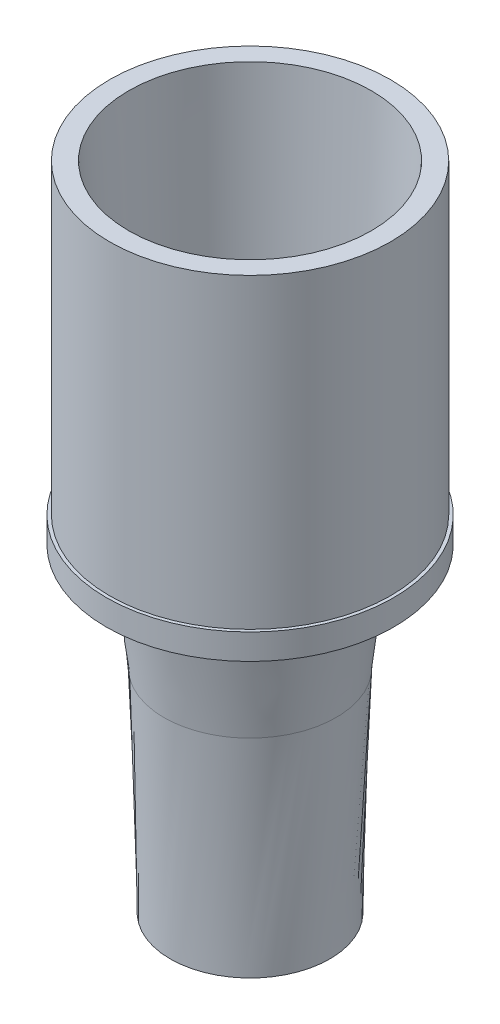
ISO-10303-21;
HEADER;
FILE_DESCRIPTION(('STEP AP214'),'2;1');
FILE_NAME('part.step','',(''),(''),'','','');
FILE_SCHEMA(('AUTOMOTIVE_DESIGN { 1 0 10303 214 1 1 1 1 }'));
ENDSEC;
DATA;
#1=APPLICATION_CONTEXT('core data for automotive mechanical design processes');
#2=APPLICATION_PROTOCOL_DEFINITION('international standard','automotive_design',2000,#1);
#3=PRODUCT_CONTEXT('',#1,'mechanical');
#4=PRODUCT('Part','Part','',(#3));
#5=PRODUCT_RELATED_PRODUCT_CATEGORY('part','',(#4));
#6=PRODUCT_DEFINITION_FORMATION('','',#4);
#7=PRODUCT_DEFINITION_CONTEXT('part definition',#1,'design');
#8=PRODUCT_DEFINITION('design','',#6,#7);
#9=PRODUCT_DEFINITION_SHAPE('','',#8);
#10=(LENGTH_UNIT() NAMED_UNIT(*) SI_UNIT(.MILLI.,.METRE.));
#11=(NAMED_UNIT(*) PLANE_ANGLE_UNIT() SI_UNIT($,.RADIAN.));
#12=(NAMED_UNIT(*) SI_UNIT($,.STERADIAN.) SOLID_ANGLE_UNIT());
#13=UNCERTAINTY_MEASURE_WITH_UNIT(LENGTH_MEASURE(1.E-05),#10,'distance_accuracy_value','');
#14=(GEOMETRIC_REPRESENTATION_CONTEXT(3) GLOBAL_UNCERTAINTY_ASSIGNED_CONTEXT((#13)) GLOBAL_UNIT_ASSIGNED_CONTEXT((#10,
#11,#12)) REPRESENTATION_CONTEXT('',''));
#15=CARTESIAN_POINT('',(0.,0.,0.));
#16=DIRECTION('',(0.,0.,1.));
#17=DIRECTION('',(1.,0.,0.));
#18=AXIS2_PLACEMENT_3D('',#15,#16,#17);
#19=CARTESIAN_POINT('',(0.,27.,0.));
#20=DIRECTION('',(0.,1.,0.));
#21=DIRECTION('',(0.,0.,1.));
#22=AXIS2_PLACEMENT_3D('',#19,#20,#21);
#23=PLANE('',#22);
#24=CARTESIAN_POINT('',(0.,27.,0.));
#25=DIRECTION('',(0.,1.,0.));
#26=DIRECTION('',(0.,0.,1.));
#27=AXIS2_PLACEMENT_3D('',#24,#25,#26);
#28=CIRCLE('',#27,5.75);
#29=CARTESIAN_POINT('',(0.,27.,5.75));
#30=VERTEX_POINT('',#29);
#31=EDGE_CURVE('E162',#30,#30,#28,.T.);
#32=ORIENTED_EDGE('',*,*,#31,.F.);
#33=EDGE_LOOP('',(#32));
#34=FACE_BOUND('',#33,.T.);
#35=CARTESIAN_POINT('',(0.,27.,0.));
#36=DIRECTION('',(0.,-1.,0.));
#37=DIRECTION('',(0.,0.,1.));
#38=AXIS2_PLACEMENT_3D('',#35,#36,#37);
#39=CIRCLE('',#38,8.5);
#40=CARTESIAN_POINT('',(0.,27.,8.5));
#41=VERTEX_POINT('',#40);
#42=EDGE_CURVE('E213',#41,#41,#39,.T.);
#43=ORIENTED_EDGE('',*,*,#42,.F.);
#44=EDGE_LOOP('',(#43));
#45=FACE_BOUND('',#44,.T.);
#46=ADVANCED_FACE('F59',(#34,#45),#23,.T.);
#47=CARTESIAN_POINT('',(-1.11708454091989,0.,-6.14935948928324));
#48=CARTESIAN_POINT('',(-4.48664223025245,25.,-5.69495755012409));
#49=CARTESIAN_POINT('',(-13.4158035194864,0.,-3.91519040744345));
#50=CARTESIAN_POINT('',(-15.8765573305006,25.,3.2783269103808));
#51=CARTESIAN_POINT('',(-11.1816344376466,0.,8.38352857112303));
#52=CARTESIAN_POINT('',(-6.90327286999572,25.,14.668242010629));
#53=CARTESIAN_POINT('',(1.1170845409199,0.,6.14935948928324));
#54=CARTESIAN_POINT('',(4.48664223025244,25.,5.69495755012409));
#55=CARTESIAN_POINT('',(13.4158035194864,0.,3.91519040744344));
#56=CARTESIAN_POINT('',(15.8765573305006,25.,-3.2783269103808));
#57=CARTESIAN_POINT('',(11.1816344376466,0.,-8.38352857112303));
#58=CARTESIAN_POINT('',(6.90327286999574,25.,-14.668242010629));
#59=CARTESIAN_POINT('',(-1.11708454091989,0.,-6.14935948928324));
#60=CARTESIAN_POINT('',(-4.48664223025245,25.,-5.69495755012409));
#61=(BOUNDED_SURFACE() B_SPLINE_SURFACE(3,1,((#47,#48),(#49,#50),(#51,#52),(#53,#54),(#55,#56),
(#57,#58),(#59,#60)),.UNSPECIFIED.,.T.,.F.,.F.) B_SPLINE_SURFACE_WITH_KNOTS((4,3,4),(2,2),(0.,
0.5,1.),(0.,1.),.UNSPECIFIED.) GEOMETRIC_REPRESENTATION_ITEM() RATIONAL_B_SPLINE_SURFACE(((1.,
1.),(0.333333333333333,0.333333333333334),(0.333333333333333,0.333333333333334),(1.,1.),
(0.333333333333333,0.333333333333333),(0.333333333333333,0.333333333333333),(1.,1.))) REPRESENTATION_ITEM('') SURFACE());
#62=CARTESIAN_POINT('',(0.,16.6169318268734,0.));
#63=DIRECTION('',(0.,1.,0.));
#64=DIRECTION('',(0.,0.,1.));
#65=AXIS2_PLACEMENT_3D('',#62,#63,#64);
#66=CIRCLE('',#65,6.74233231657427);
#67=CARTESIAN_POINT('',(-3.35675295733415,16.6169318268734,-5.84732884748297));
#68=VERTEX_POINT('',#67);
#69=EDGE_CURVE('E12',#68,#68,#66,.T.);
#70=CARTESIAN_POINT('',(0.,0.,0.));
#71=DIRECTION('',(0.,1.,0.));
#72=DIRECTION('',(0.,0.,1.));
#73=AXIS2_PLACEMENT_3D('',#70,#71,#72);
#74=CIRCLE('',#73,6.25);
#75=CARTESIAN_POINT('',(-1.11708454091989,0.,-6.14935948928324));
#76=VERTEX_POINT('',#75);
#77=EDGE_CURVE('E67',#76,#76,#74,.T.);
#78=CARTESIAN_POINT('',(-3.35675295733415,16.6169318268734,-5.84732884748297));
#79=CARTESIAN_POINT('',(-3.3334230779965,16.4438387870102,-5.85047500000172));
#80=CARTESIAN_POINT('',(-3.31009319865885,16.2707457471469,-5.85362115252047));
#81=CARTESIAN_POINT('',(-3.26343343998355,15.9245596674204,-5.85991345755798));
#82=CARTESIAN_POINT('',(-3.2401035606459,15.7514666275571,-5.86305961007673));
#83=CARTESIAN_POINT('',(-3.19344380197061,15.4052805478306,-5.86935191511424));
#84=CARTESIAN_POINT('',(-3.17011392263296,15.2321875079673,-5.87249806763299));
#85=CARTESIAN_POINT('',(-3.12345416395766,14.8860014282408,-5.8787903726705));
#86=CARTESIAN_POINT('',(-3.10012428462001,14.7129083883775,-5.88193652518925));
#87=CARTESIAN_POINT('',(-3.05346452594471,14.366722308651,-5.88822883022675));
#88=CARTESIAN_POINT('',(-3.03013464660707,14.1936292687877,-5.89137498274551));
#89=CARTESIAN_POINT('',(-2.98347488793177,13.8474431890612,-5.89766728778301));
#90=CARTESIAN_POINT('',(-2.96014500859412,13.6743501491979,-5.90081344030177));
#91=CARTESIAN_POINT('',(-2.91348524991882,13.3281640694714,-5.90710574533927));
#92=CARTESIAN_POINT('',(-2.89015537058118,13.1550710296081,-5.91025189785802));
#93=CARTESIAN_POINT('',(-2.84349561190588,12.8088849498816,-5.91654420289553));
#94=CARTESIAN_POINT('',(-2.82016573256823,12.6357919100183,-5.91969035541428));
#95=CARTESIAN_POINT('',(-2.77350597389293,12.2896058302918,-5.92598266045179));
#96=CARTESIAN_POINT('',(-2.75017609455529,12.1165127904285,-5.92912881297054));
#97=CARTESIAN_POINT('',(-2.70351633587999,11.770326710702,-5.93542111800805));
#98=CARTESIAN_POINT('',(-2.68018645654234,11.5972336708388,-5.9385672705268));
#99=CARTESIAN_POINT('',(-2.63352669786704,11.2510475911122,-5.94485957556431));
#100=CARTESIAN_POINT('',(-2.61019681852939,11.077954551249,-5.94800572808306));
#101=CARTESIAN_POINT('',(-2.5635370598541,10.7317684715224,-5.95429803312056));
#102=CARTESIAN_POINT('',(-2.54020718051645,10.5586754316592,-5.95744418563932));
#103=CARTESIAN_POINT('',(-2.49354742184115,10.2124893519326,-5.96373649067682));
#104=CARTESIAN_POINT('',(-2.4702175425035,10.0393963120694,-5.96688264319558));
#105=CARTESIAN_POINT('',(-2.42355778382821,9.69321023234284,-5.97317494823308));
#106=CARTESIAN_POINT('',(-2.40022790449056,9.52011719247957,-5.97632110075183));
#107=CARTESIAN_POINT('',(-2.35356814581526,9.17393111275304,-5.98261340578934));
#108=CARTESIAN_POINT('',(-2.33023826647761,9.00083807288978,-5.98575955830809));
#109=CARTESIAN_POINT('',(-2.28357850780232,8.65465199316325,-5.9920518633456));
#110=CARTESIAN_POINT('',(-2.26024862846467,8.48155895329998,-5.99519801586435));
#111=CARTESIAN_POINT('',(-2.21358886978937,8.13537287357346,-6.00149032090186));
#112=CARTESIAN_POINT('',(-2.19025899045172,7.96227983371019,-6.00463647342061));
#113=CARTESIAN_POINT('',(-2.14359923177643,7.61609375398366,-6.01092877845811));
#114=CARTESIAN_POINT('',(-2.12026935243878,7.44300071412039,-6.01407493097687));
#115=CARTESIAN_POINT('',(-2.07360959376348,7.09681463439386,-6.02036723601437));
#116=CARTESIAN_POINT('',(-2.05027971442583,6.9237215945306,-6.02351338853313));
#117=CARTESIAN_POINT('',(-2.00361995575053,6.57753551480407,-6.02980569357063));
#118=CARTESIAN_POINT('',(-1.98029007641289,6.4044424749408,-6.03295184608938));
#119=CARTESIAN_POINT('',(-1.93363031773759,6.05825639521427,-6.03924415112689));
#120=CARTESIAN_POINT('',(-1.91030043839994,5.88516335535101,-6.04239030364564));
#121=CARTESIAN_POINT('',(-1.86364067972464,5.53897727562448,-6.04868260868315));
#122=CARTESIAN_POINT('',(-1.840310800387,5.36588423576121,-6.0518287612019));
#123=CARTESIAN_POINT('',(-1.7936510417117,5.01969815603468,-6.05812106623941));
#124=CARTESIAN_POINT('',(-1.77032116237405,4.84660511617142,-6.06126721875816));
#125=CARTESIAN_POINT('',(-1.72366140369875,4.50041903644489,-6.06755952379566));
#126=CARTESIAN_POINT('',(-1.7003315243611,4.32732599658162,-6.07070567631442));
#127=CARTESIAN_POINT('',(-1.65367176568581,3.9811399168551,-6.07699798135192));
#128=CARTESIAN_POINT('',(-1.63034188634816,3.80804687699183,-6.08014413387068));
#129=CARTESIAN_POINT('',(-1.58368212767286,3.4618607972653,-6.08643643890818));
#130=CARTESIAN_POINT('',(-1.56035224833521,3.28876775740203,-6.08958259142693));
#131=CARTESIAN_POINT('',(-1.51369248965992,2.9425816776755,-6.09587489646444));
#132=CARTESIAN_POINT('',(-1.49036261032227,2.76948863781224,-6.09902104898319));
#133=CARTESIAN_POINT('',(-1.44370285164697,2.42330255808571,-6.1053133540207));
#134=CARTESIAN_POINT('',(-1.42037297230932,2.25020951822245,-6.10845950653945));
#135=CARTESIAN_POINT('',(-1.37371321363403,1.90402343849592,-6.11475181157696));
#136=CARTESIAN_POINT('',(-1.35038333429638,1.73093039863265,-6.11789796409571));
#137=CARTESIAN_POINT('',(-1.30372357562108,1.38474431890612,-6.12419026913321));
#138=CARTESIAN_POINT('',(-1.28039369628343,1.21165127904286,-6.12733642165197));
#139=CARTESIAN_POINT('',(-1.23373393760814,0.865465199316325,-6.13362872668947));
#140=CARTESIAN_POINT('',(-1.21040405827049,0.692372159453059,-6.13677487920823));
#141=CARTESIAN_POINT('',(-1.16374429959519,0.346186079726529,-6.14306718424573));
#142=CARTESIAN_POINT('',(-1.14041442025754,0.173093039863265,-6.14621333676448));
#143=CARTESIAN_POINT('',(-1.11708454091989,0.,-6.14935948928324));
#144=B_SPLINE_CURVE_WITH_KNOTS('',3,(#78,#79,#80,#81,#82,#83,#84,#85,#86,#87,#88,#89,#90,#91,
#92,#93,#94,#95,#96,#97,#98,#99,#100,#101,#102,#103,#104,#105,#106,#107,#108,#109,#110,#111,
#112,#113,#114,#115,#116,#117,#118,#119,#120,#121,#122,#123,#124,#125,#126,#127,#128,#129,#130,
#131,#132,#133,#134,#135,#136,#137,#138,#139,#140,#141,#142,#143),.UNSPECIFIED.,.F.,.F.,(4,2,2,
2,2,2,2,2,2,2,2,2,2,2,2,2,2,2,2,2,2,2,2,2,2,2,2,2,2,2,2,2,4),(0.,0.52405957481204,
1.04811914962408,1.57217872443612,2.09623829924817,2.62029787406021,3.14435744887225,
3.66841702368429,4.19247659849633,4.71653617330837,5.24059574812041,5.76465532293245,
6.28871489774449,6.81277447255653,7.33683404736857,7.86089362218061,8.38495319699265,
8.90901277180469,9.43307234661674,9.95713192142878,10.4811914962408,11.0052510710529,
11.5293106458649,12.0533702206769,12.577429795489,13.101489370301,13.6255489451131,
14.1496085199251,14.6736680947371,15.1977276695492,15.7217872443612,16.2458468191733,
16.7699063939853),.UNSPECIFIED.);
#145=EDGE_CURVE('BSEAM115',#68,#76,#144,.T.);
#146=ORIENTED_EDGE('',*,*,#69,.F.);
#147=ORIENTED_EDGE('',*,*,#77,.T.);
#148=ORIENTED_EDGE('',*,*,#145,.T.);
#149=ORIENTED_EDGE('',*,*,#145,.F.);
#150=EDGE_LOOP('',(#146,#148,#147,#149));
#151=FACE_BOUND('',#150,.T.);
#152=ADVANCED_FACE('F115',(#151),#61,.T.);
#153=CARTESIAN_POINT('',(0.,0.,0.));
#154=DIRECTION('',(0.,1.,0.));
#155=DIRECTION('',(0.,0.,1.));
#156=AXIS2_PLACEMENT_3D('',#153,#154,#155);
#157=PLANE('',#156);
#158=ORIENTED_EDGE('',*,*,#77,.F.);
#159=EDGE_LOOP('',(#158));
#160=FACE_BOUND('',#159,.T.);
#161=CARTESIAN_POINT('',(0.,0.,0.));
#162=DIRECTION('',(0.,-1.,0.));
#163=DIRECTION('',(0.,0.,-1.));
#164=AXIS2_PLACEMENT_3D('',#161,#162,#163);
#165=CIRCLE('',#164,4.75);
#166=CARTESIAN_POINT('',(0.,0.,-4.75));
#167=VERTEX_POINT('',#166);
#168=EDGE_CURVE('E71',#167,#167,#165,.T.);
#169=ORIENTED_EDGE('',*,*,#168,.F.);
#170=EDGE_LOOP('',(#169));
#171=FACE_BOUND('',#170,.T.);
#172=ADVANCED_FACE('F61',(#160,#171),#157,.F.);
#173=CARTESIAN_POINT('',(-5.75,25.,0.));
#174=CARTESIAN_POINT('',(-5.41666666666667,16.6666666666667,0.));
#175=CARTESIAN_POINT('',(-5.08333333333333,8.33333333333334,0.));
#176=CARTESIAN_POINT('',(-4.75,0.,0.));
#177=CARTESIAN_POINT('',(-5.75,25.,-0.158675565352893));
#178=CARTESIAN_POINT('',(-5.41666666666667,16.6666666666667,-0.149476981854173));
#179=CARTESIAN_POINT('',(-5.08333333333333,8.33333333333334,-0.140278398355454));
#180=CARTESIAN_POINT('',(-4.75,0.,-0.131079814856734));
#181=CARTESIAN_POINT('',(-5.73711755653529,25.,-0.473041582988096));
#182=CARTESIAN_POINT('',(-5.40453103151875,16.6666666666667,-0.445618882525017));
#183=CARTESIAN_POINT('',(-5.07194450650221,8.33333333333334,-0.418196182061938));
#184=CARTESIAN_POINT('',(-4.73935798148567,0.,-0.390773481598859));
#185=CARTESIAN_POINT('',(-5.68063116050321,25.,-0.934150670670049));
#186=CARTESIAN_POINT('',(-5.35131920916969,16.6666666666667,-0.879997008602219));
#187=CARTESIAN_POINT('',(-5.02200725783617,8.33333333333334,-0.825843346534389));
#188=CARTESIAN_POINT('',(-4.69269530650265,0.,-0.771689684466559));
#189=CARTESIAN_POINT('',(-5.58846663319524,25.,-1.38333522002203));
#190=CARTESIAN_POINT('',(-5.26449755301001,16.6666666666667,-1.30314187393379));
#191=CARTESIAN_POINT('',(-4.94052847282478,8.33333333333334,-1.22294852784556));
#192=CARTESIAN_POINT('',(-4.61655939263955,0.,-1.14275518175732));
#193=CARTESIAN_POINT('',(-4.83031827904677,25.,-3.99798768879932));
#194=CARTESIAN_POINT('',(-4.55029982808753,16.6666666666667,-3.76622028655009));
#195=CARTESIAN_POINT('',(-4.2702813771283,8.33333333333334,-3.53445288430085));
#196=CARTESIAN_POINT('',(-3.99026292616907,0.,-3.30268548205161));
#197=CARTESIAN_POINT('',(-2.53880904564626,25.,-5.75));
#198=CARTESIAN_POINT('',(-2.39163170966677,16.6666666666667,-5.41666666666667));
#199=CARTESIAN_POINT('',(-2.24445437368727,8.33333333333334,-5.08333333333333));
#200=CARTESIAN_POINT('',(-2.09727703770778,0.,-4.75));
#201=CARTESIAN_POINT('',(3.17351130705783,25.,-5.75));
#202=CARTESIAN_POINT('',(2.98953963708346,16.6666666666667,-5.41666666666667));
#203=CARTESIAN_POINT('',(2.80556796710909,8.33333333333334,-5.08333333333333));
#204=CARTESIAN_POINT('',(2.62159629713472,0.,-4.75));
#205=CARTESIAN_POINT('',(5.75,25.,-3.17351130705782));
#206=CARTESIAN_POINT('',(5.41666666666667,16.6666666666667,-2.98953963708346));
#207=CARTESIAN_POINT('',(5.08333333333333,8.33333333333334,-2.80556796710909));
#208=CARTESIAN_POINT('',(4.75,0.,-2.62159629713473));
#209=CARTESIAN_POINT('',(5.75,25.,3.17351130705783));
#210=CARTESIAN_POINT('',(5.41666666666667,16.6666666666667,2.98953963708346));
#211=CARTESIAN_POINT('',(5.08333333333333,8.33333333333334,2.80556796710909));
#212=CARTESIAN_POINT('',(4.75,0.,2.62159629713472));
#213=CARTESIAN_POINT('',(3.17351130705782,25.,5.75));
#214=CARTESIAN_POINT('',(2.98953963708346,16.6666666666667,5.41666666666667));
#215=CARTESIAN_POINT('',(2.80556796710909,8.33333333333334,5.08333333333333));
#216=CARTESIAN_POINT('',(2.62159629713473,0.,4.75));
#217=CARTESIAN_POINT('',(-2.53880904564626,25.,5.75));
#218=CARTESIAN_POINT('',(-2.39163170966677,16.6666666666667,5.41666666666667));
#219=CARTESIAN_POINT('',(-2.24445437368727,8.33333333333334,5.08333333333333));
#220=CARTESIAN_POINT('',(-2.09727703770778,0.,4.75));
#221=CARTESIAN_POINT('',(-4.83031827904677,25.,3.99798768879932));
#222=CARTESIAN_POINT('',(-4.55029982808754,16.6666666666667,3.76622028655009));
#223=CARTESIAN_POINT('',(-4.2702813771283,8.33333333333334,3.53445288430085));
#224=CARTESIAN_POINT('',(-3.99026292616907,0.,3.30268548205162));
#225=CARTESIAN_POINT('',(-5.58846663319524,25.,1.38333522002202));
#226=CARTESIAN_POINT('',(-5.26449755301001,16.6666666666667,1.30314187393379));
#227=CARTESIAN_POINT('',(-4.94052847282478,8.33333333333334,1.22294852784556));
#228=CARTESIAN_POINT('',(-4.61655939263955,0.,1.14275518175733));
#229=CARTESIAN_POINT('',(-5.68063116050321,25.,0.934150670670045));
#230=CARTESIAN_POINT('',(-5.35131920916969,16.6666666666667,0.879997008602217));
#231=CARTESIAN_POINT('',(-5.02200725783617,8.33333333333334,0.82584334653439));
#232=CARTESIAN_POINT('',(-4.69269530650265,0.,0.771689684466562));
#233=CARTESIAN_POINT('',(-5.73711755653529,25.,0.473041582988094));
#234=CARTESIAN_POINT('',(-5.40453103151875,16.6666666666667,0.445618882525017));
#235=CARTESIAN_POINT('',(-5.07194450650221,8.33333333333334,0.41819618206194));
#236=CARTESIAN_POINT('',(-4.73935798148567,0.,0.390773481598863));
#237=CARTESIAN_POINT('',(-5.75,25.,0.158675565352889));
#238=CARTESIAN_POINT('',(-5.41666666666667,16.6666666666667,0.149476981854172));
#239=CARTESIAN_POINT('',(-5.08333333333333,8.33333333333334,0.140278398355455));
#240=CARTESIAN_POINT('',(-4.75,0.,0.131079814856737));
#241=CARTESIAN_POINT('',(-5.75,25.,0.));
#242=CARTESIAN_POINT('',(-5.41666666666667,16.6666666666667,0.));
#243=CARTESIAN_POINT('',(-5.08333333333333,8.33333333333334,0.));
#244=CARTESIAN_POINT('',(-4.75,0.,0.));
#245=B_SPLINE_SURFACE_WITH_KNOTS('',3,3,((#173,#174,#175,#176),(#177,#178,#179,#180),(#181,#182,
#183,#184),(#185,#186,#187,#188),(#189,#190,#191,#192),(#193,#194,#195,#196),(#197,#198,#199,
#200),(#201,#202,#203,#204),(#205,#206,#207,#208),(#209,#210,#211,#212),(#213,#214,#215,#216),
(#217,#218,#219,#220),(#221,#222,#223,#224),(#225,#226,#227,#228),(#229,#230,#231,#232),(#233,
#234,#235,#236),(#237,#238,#239,#240),(#241,#242,#243,#244)),.UNSPECIFIED.,.T.,.F.,.F.,(4,1,1,1,
1,2,2,2,1,1,1,1,4),(4,4),(0.,0.0125,0.0249999999999999,0.0375000000000001,0.05,0.25,0.5,0.75,
0.95,0.9625,0.975,0.9875,1.),(0.,1.),.UNSPECIFIED.);
#246=CARTESIAN_POINT('',(-5.75,25.,0.));
#247=CARTESIAN_POINT('',(-5.75,25.,0.158675565352889));
#248=CARTESIAN_POINT('',(-5.73711755653529,25.,0.473041582988094));
#249=CARTESIAN_POINT('',(-5.68063116050321,25.,0.934150670670045));
#250=CARTESIAN_POINT('',(-5.58846663319524,25.,1.38333522002202));
#251=CARTESIAN_POINT('',(-4.83031827904677,25.,3.99798768879932));
#252=CARTESIAN_POINT('',(-2.53880904564626,25.,5.75));
#253=CARTESIAN_POINT('',(3.17351130705782,25.,5.75));
#254=CARTESIAN_POINT('',(5.75,25.,3.17351130705783));
#255=CARTESIAN_POINT('',(5.75,25.,-3.17351130705782));
#256=CARTESIAN_POINT('',(3.17351130705783,25.,-5.75));
#257=CARTESIAN_POINT('',(-2.53880904564626,25.,-5.75));
#258=CARTESIAN_POINT('',(-4.83031827904677,25.,-3.99798768879932));
#259=CARTESIAN_POINT('',(-5.58846663319524,25.,-1.38333522002203));
#260=CARTESIAN_POINT('',(-5.68063116050321,25.,-0.934150670670049));
#261=CARTESIAN_POINT('',(-5.73711755653529,25.,-0.473041582988096));
#262=CARTESIAN_POINT('',(-5.75,25.,-0.158675565352893));
#263=CARTESIAN_POINT('',(-5.75,25.,0.));
#264=B_SPLINE_CURVE_WITH_KNOTS('',3,(#246,#247,#248,#249,#250,#251,#252,#253,#254,#255,#256,
#257,#258,#259,#260,#261,#262,#263),.UNSPECIFIED.,.T.,.F.,(4,1,1,1,1,2,2,2,1,1,1,1,4),(0.,
0.0125,0.025,0.0375,0.05,0.25,0.5,0.75,0.95,0.9625,0.975,0.9875,1.),.UNSPECIFIED.);
#265=CARTESIAN_POINT('',(-5.75,25.,0.));
#266=VERTEX_POINT('',#265);
#267=EDGE_CURVE('E171',#266,#266,#264,.T.);
#268=ORIENTED_EDGE('',*,*,#267,.T.);
#269=EDGE_LOOP('',(#268));
#270=FACE_BOUND('',#269,.T.);
#271=ORIENTED_EDGE('',*,*,#168,.T.);
#272=EDGE_LOOP('',(#271));
#273=FACE_BOUND('',#272,.T.);
#274=ADVANCED_FACE('F92',(#270,#273),#245,.F.);
#275=CARTESIAN_POINT('',(0.,25.,0.));
#276=DIRECTION('',(0.,1.,0.));
#277=DIRECTION('',(0.,0.,1.));
#278=AXIS2_PLACEMENT_3D('',#275,#276,#277);
#279=PLANE('',#278);
#280=CARTESIAN_POINT('',(0.,25.,0.));
#281=DIRECTION('',(0.,-1.,0.));
#282=DIRECTION('',(0.,0.,-1.));
#283=AXIS2_PLACEMENT_3D('',#280,#281,#282);
#284=CIRCLE('',#283,7.75);
#285=CARTESIAN_POINT('',(0.,25.,-7.75));
#286=VERTEX_POINT('',#285);
#287=EDGE_CURVE('E209',#286,#286,#284,.T.);
#288=ORIENTED_EDGE('',*,*,#287,.F.);
#289=EDGE_LOOP('',(#288));
#290=FACE_BOUND('',#289,.T.);
#291=CARTESIAN_POINT('',(0.,25.,0.));
#292=DIRECTION('',(0.,1.,0.));
#293=DIRECTION('',(0.,0.,1.));
#294=AXIS2_PLACEMENT_3D('',#291,#292,#293);
#295=CIRCLE('',#294,11.25);
#296=CARTESIAN_POINT('',(0.,25.,11.25));
#297=VERTEX_POINT('',#296);
#298=EDGE_CURVE('E159',#297,#297,#295,.T.);
#299=ORIENTED_EDGE('',*,*,#298,.F.);
#300=EDGE_LOOP('',(#299));
#301=FACE_BOUND('',#300,.T.);
#302=ADVANCED_FACE('F111',(#290,#301),#279,.F.);
#303=CARTESIAN_POINT('',(0.,27.,0.));
#304=DIRECTION('',(0.,1.,0.));
#305=DIRECTION('',(0.,0.,1.));
#306=AXIS2_PLACEMENT_3D('',#303,#304,#305);
#307=CIRCLE('',#306,11.);
#308=CARTESIAN_POINT('',(0.,27.,11.));
#309=VERTEX_POINT('',#308);
#310=EDGE_CURVE('E156',#309,#309,#307,.T.);
#311=ORIENTED_EDGE('',*,*,#310,.F.);
#312=EDGE_LOOP('',(#311));
#313=FACE_BOUND('',#312,.T.);
#314=CARTESIAN_POINT('',(0.,27.,0.));
#315=DIRECTION('',(0.,1.,0.));
#316=DIRECTION('',(0.,0.,1.));
#317=AXIS2_PLACEMENT_3D('',#314,#315,#316);
#318=CIRCLE('',#317,11.25);
#319=CARTESIAN_POINT('',(0.,27.,11.25));
#320=VERTEX_POINT('',#319);
#321=EDGE_CURVE('E76',#320,#320,#318,.T.);
#322=ORIENTED_EDGE('',*,*,#321,.T.);
#323=EDGE_LOOP('',(#322));
#324=FACE_BOUND('',#323,.T.);
#325=ADVANCED_FACE('F138',(#313,#324),#23,.T.);
#326=CARTESIAN_POINT('',(0.,27.,0.));
#327=DIRECTION('',(0.,-1.,0.));
#328=DIRECTION('',(0.,0.,-1.));
#329=AXIS2_PLACEMENT_3D('',#326,#327,#328);
#330=CYLINDRICAL_SURFACE('',#329,11.25);
#331=ORIENTED_EDGE('',*,*,#321,.F.);
#332=EDGE_LOOP('',(#331));
#333=FACE_BOUND('',#332,.T.);
#334=ORIENTED_EDGE('',*,*,#298,.T.);
#335=EDGE_LOOP('',(#334));
#336=FACE_BOUND('',#335,.T.);
#337=ADVANCED_FACE('F113',(#333,#336),#330,.T.);
#338=CARTESIAN_POINT('',(0.,27.,0.));
#339=DIRECTION('',(0.,-1.,0.));
#340=DIRECTION('',(0.,0.,-1.));
#341=AXIS2_PLACEMENT_3D('',#338,#339,#340);
#342=CYLINDRICAL_SURFACE('',#341,5.75);
#343=ORIENTED_EDGE('',*,*,#31,.T.);
#344=EDGE_LOOP('',(#343));
#345=FACE_BOUND('',#344,.T.);
#346=ORIENTED_EDGE('',*,*,#267,.F.);
#347=EDGE_LOOP('',(#346));
#348=FACE_BOUND('',#347,.T.);
#349=ADVANCED_FACE('F150',(#345,#348),#342,.F.);
#350=CARTESIAN_POINT('',(0.,51.,0.));
#351=DIRECTION('',(0.,1.,0.));
#352=DIRECTION('',(0.,0.,1.));
#353=AXIS2_PLACEMENT_3D('',#350,#351,#352);
#354=PLANE('',#353);
#355=CARTESIAN_POINT('',(0.,51.,0.));
#356=DIRECTION('',(0.,1.,0.));
#357=DIRECTION('',(0.,0.,1.));
#358=AXIS2_PLACEMENT_3D('',#355,#356,#357);
#359=CIRCLE('',#358,9.5);
#360=CARTESIAN_POINT('',(0.,51.,9.5));
#361=VERTEX_POINT('',#360);
#362=EDGE_CURVE('E210',#361,#361,#359,.T.);
#363=ORIENTED_EDGE('',*,*,#362,.F.);
#364=EDGE_LOOP('',(#363));
#365=FACE_BOUND('',#364,.T.);
#366=CARTESIAN_POINT('',(0.,51.,0.));
#367=DIRECTION('',(0.,1.,0.));
#368=DIRECTION('',(0.,0.,1.));
#369=AXIS2_PLACEMENT_3D('',#366,#367,#368);
#370=CIRCLE('',#369,11.);
#371=CARTESIAN_POINT('',(0.,51.,11.));
#372=VERTEX_POINT('',#371);
#373=EDGE_CURVE('E218',#372,#372,#370,.T.);
#374=ORIENTED_EDGE('',*,*,#373,.T.);
#375=EDGE_LOOP('',(#374));
#376=FACE_BOUND('',#375,.T.);
#377=ADVANCED_FACE('F182',(#365,#376),#354,.T.);
#378=CARTESIAN_POINT('',(0.,51.,0.));
#379=DIRECTION('',(0.,-1.,0.));
#380=DIRECTION('',(0.,0.,-1.));
#381=AXIS2_PLACEMENT_3D('',#378,#379,#380);
#382=CYLINDRICAL_SURFACE('',#381,11.);
#383=ORIENTED_EDGE('',*,*,#373,.F.);
#384=EDGE_LOOP('',(#383));
#385=FACE_BOUND('',#384,.T.);
#386=ORIENTED_EDGE('',*,*,#310,.T.);
#387=EDGE_LOOP('',(#386));
#388=FACE_BOUND('',#387,.T.);
#389=ADVANCED_FACE('F184',(#385,#388),#382,.T.);
#390=CARTESIAN_POINT('',(0.,27.,0.));
#391=DIRECTION('',(0.,1.,0.));
#392=DIRECTION('',(0.,0.,1.));
#393=AXIS2_PLACEMENT_3D('',#390,#391,#392);
#394=CONICAL_SURFACE('',#393,8.5,0.0416425790985884);
#395=ORIENTED_EDGE('',*,*,#362,.T.);
#396=EDGE_LOOP('',(#395));
#397=FACE_BOUND('',#396,.T.);
#398=ORIENTED_EDGE('',*,*,#42,.T.);
#399=EDGE_LOOP('',(#398));
#400=FACE_BOUND('',#399,.T.);
#401=ADVANCED_FACE('F187',(#397,#400),#394,.F.);
#402=CARTESIAN_POINT('',(-4.74743278084631,0.,-4.06501931008277));
#403=CARTESIAN_POINT('',(-0.233699061561638,25.,-7.7464756340303));
#404=CARTESIAN_POINT('',(-12.8774714010119,0.,5.42984625160984));
#405=CARTESIAN_POINT('',(-15.7266503296222,25.,-7.27907751090703));
#406=CARTESIAN_POINT('',(-3.38260583931924,0.,13.5598848717754));
#407=CARTESIAN_POINT('',(-15.259252206499,25.,8.21387375715358));
#408=CARTESIAN_POINT('',(4.74743278084631,0.,4.06501931008278));
#409=CARTESIAN_POINT('',(0.233699061561637,25.,7.7464756340303));
#410=CARTESIAN_POINT('',(12.8774714010119,0.,-5.42984625160984));
#411=CARTESIAN_POINT('',(15.7266503296222,25.,7.27907751090703));
#412=CARTESIAN_POINT('',(3.38260583931925,0.,-13.5598848717754));
#413=CARTESIAN_POINT('',(15.259252206499,25.,-8.21387375715358));
#414=CARTESIAN_POINT('',(-4.74743278084631,0.,-4.06501931008277));
#415=CARTESIAN_POINT('',(-0.233699061561638,25.,-7.7464756340303));
#416=(BOUNDED_SURFACE() B_SPLINE_SURFACE(3,1,((#402,#403),(#404,#405),(#406,#407),(#408,#409),
(#410,#411),(#412,#413),(#414,#415)),.UNSPECIFIED.,.T.,.F.,.F.) B_SPLINE_SURFACE_WITH_KNOTS((4,
3,4),(2,2),(0.,0.5,1.),(0.,1.),
.UNSPECIFIED.) GEOMETRIC_REPRESENTATION_ITEM() RATIONAL_B_SPLINE_SURFACE(((1.,1.),
(0.333333333333334,0.333333333333333),(0.333333333333334,0.333333333333333),(1.,1.),
(0.333333333333333,0.333333333333333),(0.333333333333333,0.333333333333333),(1.,1.))) REPRESENTATION_ITEM('') SURFACE());
#417=ORIENTED_EDGE('',*,*,#69,.T.);
#418=EDGE_LOOP('',(#417));
#419=FACE_BOUND('',#418,.T.);
#420=ORIENTED_EDGE('',*,*,#287,.T.);
#421=EDGE_LOOP('',(#420));
#422=FACE_BOUND('',#421,.T.);
#423=ADVANCED_FACE('F194',(#419,#422),#416,.T.);
#424=CLOSED_SHELL('',(#46,#152,#172,#274,#302,#325,#337,#349,#377,#389,#401,#423));
#425=MANIFOLD_SOLID_BREP('B2',#424);
#426=ADVANCED_BREP_SHAPE_REPRESENTATION('',(#18,#425),#14);
#427=SHAPE_DEFINITION_REPRESENTATION(#9,#426);
ENDSEC;
END-ISO-10303-21;
